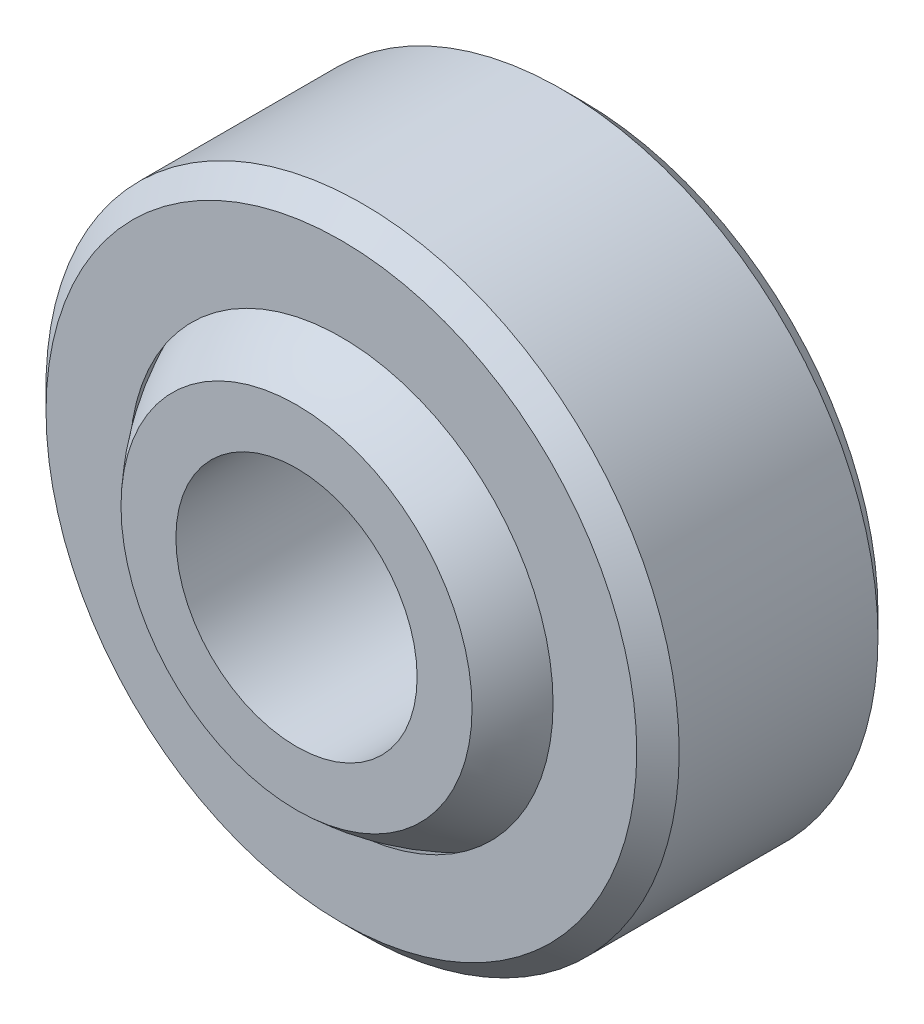
ISO-10303-21;
HEADER;
FILE_DESCRIPTION(('STEP AP214'),'2;1');
FILE_NAME('part.step','',(''),(''),'','','');
FILE_SCHEMA(('AUTOMOTIVE_DESIGN { 1 0 10303 214 1 1 1 1 }'));
ENDSEC;
DATA;
#1=APPLICATION_CONTEXT('core data for automotive mechanical design processes');
#2=APPLICATION_PROTOCOL_DEFINITION('international standard','automotive_design',2000,#1);
#3=PRODUCT_CONTEXT('',#1,'mechanical');
#4=PRODUCT('Part','Part','',(#3));
#5=PRODUCT_RELATED_PRODUCT_CATEGORY('part','',(#4));
#6=PRODUCT_DEFINITION_FORMATION('','',#4);
#7=PRODUCT_DEFINITION_CONTEXT('part definition',#1,'design');
#8=PRODUCT_DEFINITION('design','',#6,#7);
#9=PRODUCT_DEFINITION_SHAPE('','',#8);
#10=(LENGTH_UNIT() NAMED_UNIT(*) SI_UNIT(.MILLI.,.METRE.));
#11=(NAMED_UNIT(*) PLANE_ANGLE_UNIT() SI_UNIT($,.RADIAN.));
#12=(NAMED_UNIT(*) SI_UNIT($,.STERADIAN.) SOLID_ANGLE_UNIT());
#13=UNCERTAINTY_MEASURE_WITH_UNIT(LENGTH_MEASURE(1.E-05),#10,'distance_accuracy_value','');
#14=(GEOMETRIC_REPRESENTATION_CONTEXT(3) GLOBAL_UNCERTAINTY_ASSIGNED_CONTEXT((#13)) GLOBAL_UNIT_ASSIGNED_CONTEXT((#10,
#11,#12)) REPRESENTATION_CONTEXT('',''));
#15=CARTESIAN_POINT('',(0.,0.,0.));
#16=DIRECTION('',(0.,0.,1.));
#17=DIRECTION('',(1.,0.,0.));
#18=AXIS2_PLACEMENT_3D('',#15,#16,#17);
#19=CARTESIAN_POINT('',(0.,0.,0.));
#20=DIRECTION('',(0.,-1.,0.));
#21=DIRECTION('',(-1.,0.,0.));
#22=AXIS2_PLACEMENT_3D('',#19,#20,#21);
#23=SPHERICAL_SURFACE('',#22,6.35);
#24=CARTESIAN_POINT('',(0.,0.,0.));
#25=DIRECTION('',(0.,0.,1.));
#26=DIRECTION('',(1.,0.,0.));
#27=AXIS2_PLACEMENT_3D('',#24,#25,#26);
#28=SPHERICAL_SURFACE('',#27,6.35);
#29=CARTESIAN_POINT('',(0.,0.,-4.3561));
#30=DIRECTION('',(0.,0.,1.));
#31=DIRECTION('',(1.,0.,0.));
#32=AXIS2_PLACEMENT_3D('',#29,#30,#31);
#33=CIRCLE('',#32,4.62026977459109);
#34=CARTESIAN_POINT('',(4.62026977459109,0.,-4.3561));
#35=VERTEX_POINT('',#34);
#36=EDGE_CURVE('E55',#35,#35,#33,.F.);
#37=ORIENTED_EDGE('',*,*,#36,.F.);
#38=EDGE_LOOP('',(#37));
#39=FACE_BOUND('',#38,.T.);
#40=CARTESIAN_POINT('',(0.,0.,4.3561));
#41=DIRECTION('',(0.,0.,-1.));
#42=DIRECTION('',(-1.,0.,0.));
#43=AXIS2_PLACEMENT_3D('',#40,#41,#42);
#44=CIRCLE('',#43,4.62026977459109);
#45=CARTESIAN_POINT('',(-4.62026977459109,0.,4.3561));
#46=VERTEX_POINT('',#45);
#47=EDGE_CURVE('E11',#46,#46,#44,.F.);
#48=ORIENTED_EDGE('',*,*,#47,.F.);
#49=EDGE_LOOP('',(#48));
#50=FACE_BOUND('',#49,.T.);
#51=ADVANCED_FACE('F43',(#39,#50),#28,.T.);
#52=CARTESIAN_POINT('',(0.,0.,-6.35));
#53=DIRECTION('',(0.,0.,1.));
#54=DIRECTION('',(1.,0.,0.));
#55=AXIS2_PLACEMENT_3D('',#52,#53,#54);
#56=CYLINDRICAL_SURFACE('',#55,3.175);
#57=CARTESIAN_POINT('',(0.,0.,-4.3561));
#58=DIRECTION('',(0.,0.,1.));
#59=DIRECTION('',(1.,0.,0.));
#60=AXIS2_PLACEMENT_3D('',#57,#58,#59);
#61=CIRCLE('',#60,3.175);
#62=CARTESIAN_POINT('',(3.175,0.,-4.3561));
#63=VERTEX_POINT('',#62);
#64=EDGE_CURVE('E46',#63,#63,#61,.F.);
#65=ORIENTED_EDGE('',*,*,#64,.T.);
#66=EDGE_LOOP('',(#65));
#67=FACE_BOUND('',#66,.T.);
#68=CARTESIAN_POINT('',(0.,0.,4.3561));
#69=DIRECTION('',(0.,0.,-1.));
#70=DIRECTION('',(-1.,0.,0.));
#71=AXIS2_PLACEMENT_3D('',#68,#69,#70);
#72=CIRCLE('',#71,3.175);
#73=CARTESIAN_POINT('',(-3.175,0.,4.3561));
#74=VERTEX_POINT('',#73);
#75=EDGE_CURVE('E50',#74,#74,#72,.F.);
#76=ORIENTED_EDGE('',*,*,#75,.T.);
#77=EDGE_LOOP('',(#76));
#78=FACE_BOUND('',#77,.T.);
#79=ADVANCED_FACE('F63',(#67,#78),#56,.F.);
#80=CARTESIAN_POINT('',(-8.33374,8.33374,4.3561));
#81=DIRECTION('',(0.,0.,-1.));
#82=DIRECTION('',(-1.,0.,0.));
#83=AXIS2_PLACEMENT_3D('',#80,#81,#82);
#84=PLANE('',#83);
#85=ORIENTED_EDGE('',*,*,#47,.T.);
#86=EDGE_LOOP('',(#85));
#87=FACE_BOUND('',#86,.T.);
#88=ORIENTED_EDGE('',*,*,#75,.F.);
#89=EDGE_LOOP('',(#88));
#90=FACE_BOUND('',#89,.T.);
#91=ADVANCED_FACE('F68',(#87,#90),#84,.F.);
#92=CARTESIAN_POINT('',(-8.33374,-8.33374,-4.3561));
#93=DIRECTION('',(0.,0.,1.));
#94=DIRECTION('',(1.,0.,0.));
#95=AXIS2_PLACEMENT_3D('',#92,#93,#94);
#96=PLANE('',#95);
#97=ORIENTED_EDGE('',*,*,#36,.T.);
#98=EDGE_LOOP('',(#97));
#99=FACE_BOUND('',#98,.T.);
#100=ORIENTED_EDGE('',*,*,#64,.F.);
#101=EDGE_LOOP('',(#100));
#102=FACE_BOUND('',#101,.T.);
#103=ADVANCED_FACE('F66',(#99,#102),#96,.F.);
#104=CLOSED_SHELL('',(#51,#79,#91,#103));
#105=MANIFOLD_SOLID_BREP('B2',#104);
#106=CARTESIAN_POINT('',(0.,0.,3.175));
#107=DIRECTION('',(0.,0.,-1.));
#108=DIRECTION('',(-1.,0.,0.));
#109=AXIS2_PLACEMENT_3D('',#106,#107,#108);
#110=CYLINDRICAL_SURFACE('',#109,8.33374);
#111=CARTESIAN_POINT('',(0.,0.,2.6162));
#112=DIRECTION('',(0.,0.,1.));
#113=DIRECTION('',(1.,0.,0.));
#114=AXIS2_PLACEMENT_3D('',#111,#112,#113);
#115=CIRCLE('',#114,8.33374);
#116=CARTESIAN_POINT('',(8.33374,0.,2.6162));
#117=VERTEX_POINT('',#116);
#118=EDGE_CURVE('E112',#117,#117,#115,.F.);
#119=ORIENTED_EDGE('',*,*,#118,.T.);
#120=EDGE_LOOP('',(#119));
#121=FACE_BOUND('',#120,.T.);
#122=CARTESIAN_POINT('',(0.,0.,-2.6162));
#123=DIRECTION('',(0.,0.,1.));
#124=DIRECTION('',(1.,0.,0.));
#125=AXIS2_PLACEMENT_3D('',#122,#123,#124);
#126=CIRCLE('',#125,8.33374);
#127=CARTESIAN_POINT('',(8.33374,0.,-2.6162));
#128=VERTEX_POINT('',#127);
#129=EDGE_CURVE('E116',#128,#128,#126,.T.);
#130=ORIENTED_EDGE('',*,*,#129,.T.);
#131=EDGE_LOOP('',(#130));
#132=FACE_BOUND('',#131,.T.);
#133=ADVANCED_FACE('F105',(#121,#132),#110,.T.);
#134=CARTESIAN_POINT('',(0.,0.,3.175));
#135=DIRECTION('',(0.,0.,1.));
#136=DIRECTION('',(1.,0.,0.));
#137=AXIS2_PLACEMENT_3D('',#134,#135,#136);
#138=PLANE('',#137);
#139=CARTESIAN_POINT('',(0.,0.,3.175));
#140=DIRECTION('',(0.,0.,1.));
#141=DIRECTION('',(1.,0.,0.));
#142=AXIS2_PLACEMENT_3D('',#139,#140,#141);
#143=CIRCLE('',#142,7.77494);
#144=CARTESIAN_POINT('',(7.77494,0.,3.175));
#145=VERTEX_POINT('',#144);
#146=EDGE_CURVE('E120',#145,#145,#143,.T.);
#147=ORIENTED_EDGE('',*,*,#146,.T.);
#148=EDGE_LOOP('',(#147));
#149=FACE_BOUND('',#148,.T.);
#150=CARTESIAN_POINT('',(0.,0.,3.175));
#151=DIRECTION('',(0.,0.,1.));
#152=DIRECTION('',(1.,0.,0.));
#153=AXIS2_PLACEMENT_3D('',#150,#151,#152);
#154=CIRCLE('',#153,5.57246419907746);
#155=CARTESIAN_POINT('',(5.57246419907746,0.,3.175));
#156=VERTEX_POINT('',#155);
#157=EDGE_CURVE('E125',#156,#156,#154,.T.);
#158=ORIENTED_EDGE('',*,*,#157,.F.);
#159=EDGE_LOOP('',(#158));
#160=FACE_BOUND('',#159,.T.);
#161=ADVANCED_FACE('F135',(#149,#160),#138,.T.);
#162=CARTESIAN_POINT('',(0.,0.,-3.175));
#163=DIRECTION('',(0.,0.,1.));
#164=DIRECTION('',(1.,0.,0.));
#165=AXIS2_PLACEMENT_3D('',#162,#163,#164);
#166=PLANE('',#165);
#167=CARTESIAN_POINT('',(0.,0.,-3.175));
#168=DIRECTION('',(0.,0.,1.));
#169=DIRECTION('',(1.,0.,0.));
#170=AXIS2_PLACEMENT_3D('',#167,#168,#169);
#171=CIRCLE('',#170,7.77494);
#172=CARTESIAN_POINT('',(7.77494,0.,-3.175));
#173=VERTEX_POINT('',#172);
#174=EDGE_CURVE('E42',#173,#173,#171,.F.);
#175=ORIENTED_EDGE('',*,*,#174,.T.);
#176=EDGE_LOOP('',(#175));
#177=FACE_BOUND('',#176,.T.);
#178=CARTESIAN_POINT('',(0.,0.,-3.175));
#179=DIRECTION('',(0.,0.,1.));
#180=DIRECTION('',(1.,0.,0.));
#181=AXIS2_PLACEMENT_3D('',#178,#179,#180);
#182=CIRCLE('',#181,5.57246419907746);
#183=CARTESIAN_POINT('',(5.57246419907746,0.,-3.175));
#184=VERTEX_POINT('',#183);
#185=EDGE_CURVE('E126',#184,#184,#182,.T.);
#186=ORIENTED_EDGE('',*,*,#185,.T.);
#187=EDGE_LOOP('',(#186));
#188=FACE_BOUND('',#187,.T.);
#189=ADVANCED_FACE('F137',(#177,#188),#166,.F.);
#190=CARTESIAN_POINT('',(0.,0.,0.));
#191=DIRECTION('',(0.,-1.,0.));
#192=DIRECTION('',(-1.,0.,0.));
#193=AXIS2_PLACEMENT_3D('',#190,#191,#192);
#194=SPHERICAL_SURFACE('',#193,6.4135);
#195=CARTESIAN_POINT('',(0.,0.,0.));
#196=DIRECTION('',(0.,0.,1.));
#197=DIRECTION('',(1.,0.,0.));
#198=AXIS2_PLACEMENT_3D('',#195,#196,#197);
#199=SPHERICAL_SURFACE('',#198,6.4135);
#200=ORIENTED_EDGE('',*,*,#157,.T.);
#201=EDGE_LOOP('',(#200));
#202=FACE_BOUND('',#201,.T.);
#203=ORIENTED_EDGE('',*,*,#185,.F.);
#204=EDGE_LOOP('',(#203));
#205=FACE_BOUND('',#204,.T.);
#206=ADVANCED_FACE('F132',(#202,#205),#199,.F.);
#207=CARTESIAN_POINT('',(0.,0.,3.175));
#208=DIRECTION('',(0.,0.,-1.));
#209=DIRECTION('',(-1.,0.,0.));
#210=AXIS2_PLACEMENT_3D('',#207,#208,#209);
#211=CONICAL_SURFACE('',#210,7.77494,0.785398163397446);
#212=ORIENTED_EDGE('',*,*,#118,.F.);
#213=EDGE_LOOP('',(#212));
#214=FACE_BOUND('',#213,.T.);
#215=ORIENTED_EDGE('',*,*,#146,.F.);
#216=EDGE_LOOP('',(#215));
#217=FACE_BOUND('',#216,.T.);
#218=ADVANCED_FACE('F147',(#214,#217),#211,.T.);
#219=CARTESIAN_POINT('',(0.,0.,-2.6162));
#220=DIRECTION('',(0.,0.,1.));
#221=DIRECTION('',(1.,0.,0.));
#222=AXIS2_PLACEMENT_3D('',#219,#220,#221);
#223=CONICAL_SURFACE('',#222,8.33374,0.785398163397449);
#224=ORIENTED_EDGE('',*,*,#174,.F.);
#225=EDGE_LOOP('',(#224));
#226=FACE_BOUND('',#225,.T.);
#227=ORIENTED_EDGE('',*,*,#129,.F.);
#228=EDGE_LOOP('',(#227));
#229=FACE_BOUND('',#228,.T.);
#230=ADVANCED_FACE('F107',(#226,#229),#223,.T.);
#231=CLOSED_SHELL('',(#133,#161,#189,#206,#218,#230));
#232=MANIFOLD_SOLID_BREP('B6',#231);
#233=ADVANCED_BREP_SHAPE_REPRESENTATION('',(#18,#105,#232),#14);
#234=SHAPE_DEFINITION_REPRESENTATION(#9,#233);
ENDSEC;
END-ISO-10303-21;
